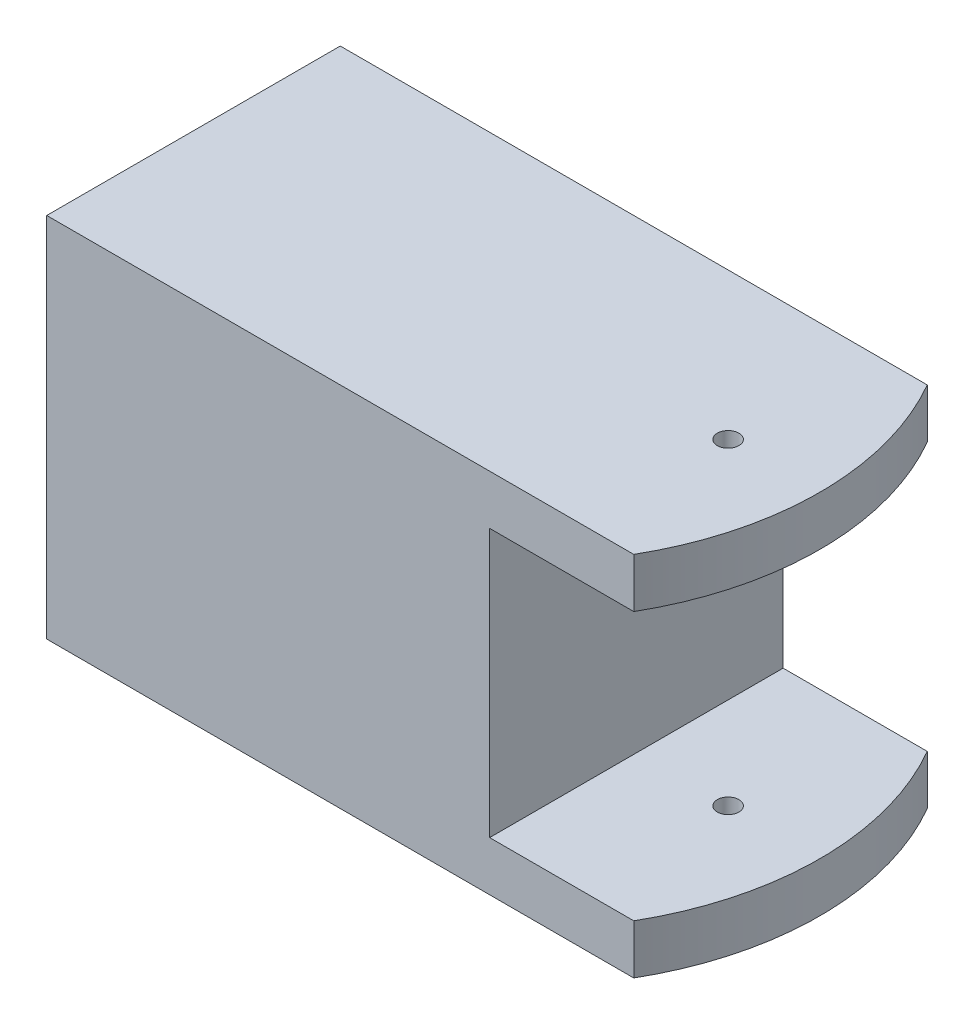
ISO-10303-21;
HEADER;
FILE_DESCRIPTION(('STEP AP214'),'2;1');
FILE_NAME('part.step','',(''),(''),'','','');
FILE_SCHEMA(('AUTOMOTIVE_DESIGN { 1 0 10303 214 1 1 1 1 }'));
ENDSEC;
DATA;
#1=APPLICATION_CONTEXT('core data for automotive mechanical design processes');
#2=APPLICATION_PROTOCOL_DEFINITION('international standard','automotive_design',2000,#1);
#3=PRODUCT_CONTEXT('',#1,'mechanical');
#4=PRODUCT('Part','Part','',(#3));
#5=PRODUCT_RELATED_PRODUCT_CATEGORY('part','',(#4));
#6=PRODUCT_DEFINITION_FORMATION('','',#4);
#7=PRODUCT_DEFINITION_CONTEXT('part definition',#1,'design');
#8=PRODUCT_DEFINITION('design','',#6,#7);
#9=PRODUCT_DEFINITION_SHAPE('','',#8);
#10=(LENGTH_UNIT() NAMED_UNIT(*) SI_UNIT(.MILLI.,.METRE.));
#11=(NAMED_UNIT(*) PLANE_ANGLE_UNIT() SI_UNIT($,.RADIAN.));
#12=(NAMED_UNIT(*) SI_UNIT($,.STERADIAN.) SOLID_ANGLE_UNIT());
#13=UNCERTAINTY_MEASURE_WITH_UNIT(LENGTH_MEASURE(1.E-05),#10,'distance_accuracy_value','');
#14=(GEOMETRIC_REPRESENTATION_CONTEXT(3) GLOBAL_UNCERTAINTY_ASSIGNED_CONTEXT((#13)) GLOBAL_UNIT_ASSIGNED_CONTEXT((#10,
#11,#12)) REPRESENTATION_CONTEXT('',''));
#15=CARTESIAN_POINT('',(0.,0.,0.));
#16=DIRECTION('',(0.,0.,1.));
#17=DIRECTION('',(1.,0.,0.));
#18=AXIS2_PLACEMENT_3D('',#15,#16,#17);
#19=CARTESIAN_POINT('',(-34.6410161513776,-25.,0.));
#20=DIRECTION('',(0.,1.,0.));
#21=DIRECTION('',(0.,0.,1.));
#22=AXIS2_PLACEMENT_3D('',#19,#20,#21);
#23=CYLINDRICAL_SURFACE('',#22,40.);
#24=CARTESIAN_POINT('',(-34.6410161513776,18.25,0.));
#25=DIRECTION('',(0.,1.,0.));
#26=DIRECTION('',(0.,0.,1.));
#27=AXIS2_PLACEMENT_3D('',#24,#25,#26);
#28=CIRCLE('',#27,40.);
#29=CARTESIAN_POINT('',(0.,18.25,-20.));
#30=VERTEX_POINT('',#29);
#31=CARTESIAN_POINT('',(0.,18.25,20.));
#32=VERTEX_POINT('',#31);
#33=EDGE_CURVE('E148',#30,#32,#28,.F.);
#34=ORIENTED_EDGE('',*,*,#33,.F.);
#35=DIRECTION('',(0.,1.,0.));
#36=VECTOR('',#35,1.);
#37=CARTESIAN_POINT('',(0.,-25.,-20.));
#38=LINE('',#37,#36);
#39=CARTESIAN_POINT('',(0.,25.,-20.));
#40=VERTEX_POINT('',#39);
#41=EDGE_CURVE('E181',#30,#40,#38,.T.);
#42=ORIENTED_EDGE('',*,*,#41,.T.);
#43=CARTESIAN_POINT('',(-34.6410161513776,25.,0.));
#44=DIRECTION('',(0.,1.,0.));
#45=DIRECTION('',(0.,0.,-1.));
#46=AXIS2_PLACEMENT_3D('',#43,#44,#45);
#47=CIRCLE('',#46,40.);
#48=CARTESIAN_POINT('',(0.,25.,20.));
#49=VERTEX_POINT('',#48);
#50=EDGE_CURVE('E151',#49,#40,#47,.T.);
#51=ORIENTED_EDGE('',*,*,#50,.F.);
#52=DIRECTION('',(0.,1.,0.));
#53=VECTOR('',#52,1.);
#54=CARTESIAN_POINT('',(0.,-25.,20.));
#55=LINE('',#54,#53);
#56=EDGE_CURVE('E184',#32,#49,#55,.T.);
#57=ORIENTED_EDGE('',*,*,#56,.F.);
#58=EDGE_LOOP('',(#34,#42,#51,#57));
#59=FACE_BOUND('',#58,.T.);
#60=ADVANCED_FACE('F45',(#59),#23,.T.);
#61=CARTESIAN_POINT('',(-34.6410161513776,-18.25,0.));
#62=DIRECTION('',(0.,-1.,0.));
#63=DIRECTION('',(0.,0.,-1.));
#64=AXIS2_PLACEMENT_3D('',#61,#62,#63);
#65=CIRCLE('',#64,40.);
#66=CARTESIAN_POINT('',(0.,-18.25,20.));
#67=VERTEX_POINT('',#66);
#68=CARTESIAN_POINT('',(0.,-18.25,-20.));
#69=VERTEX_POINT('',#68);
#70=EDGE_CURVE('E62',#67,#69,#65,.F.);
#71=ORIENTED_EDGE('',*,*,#70,.F.);
#72=CARTESIAN_POINT('',(0.,-25.,20.));
#73=VERTEX_POINT('',#72);
#74=EDGE_CURVE('E55',#73,#67,#55,.T.);
#75=ORIENTED_EDGE('',*,*,#74,.F.);
#76=CARTESIAN_POINT('',(-34.6410161513776,-25.,0.));
#77=DIRECTION('',(0.,1.,0.));
#78=DIRECTION('',(0.,0.,-1.));
#79=AXIS2_PLACEMENT_3D('',#76,#77,#78);
#80=CIRCLE('',#79,40.);
#81=CARTESIAN_POINT('',(0.,-25.,-20.));
#82=VERTEX_POINT('',#81);
#83=EDGE_CURVE('E167',#73,#82,#80,.T.);
#84=ORIENTED_EDGE('',*,*,#83,.T.);
#85=EDGE_CURVE('E191',#82,#69,#38,.T.);
#86=ORIENTED_EDGE('',*,*,#85,.T.);
#87=EDGE_LOOP('',(#71,#75,#84,#86));
#88=FACE_BOUND('',#87,.T.);
#89=ADVANCED_FACE('F47',(#88),#23,.T.);
#90=CARTESIAN_POINT('',(0.,-25.,20.));
#91=DIRECTION('',(0.,0.,1.));
#92=DIRECTION('',(1.,0.,0.));
#93=AXIS2_PLACEMENT_3D('',#90,#91,#92);
#94=PLANE('',#93);
#95=DIRECTION('',(-1.,0.,0.));
#96=VECTOR('',#95,1.);
#97=CARTESIAN_POINT('',(-19.6410161513775,18.25,20.));
#98=LINE('',#97,#96);
#99=CARTESIAN_POINT('',(-19.6410161513775,18.25,20.));
#100=VERTEX_POINT('',#99);
#101=EDGE_CURVE('E133',#32,#100,#98,.T.);
#102=ORIENTED_EDGE('',*,*,#101,.F.);
#103=ORIENTED_EDGE('',*,*,#56,.T.);
#104=DIRECTION('',(1.,0.,0.));
#105=VECTOR('',#104,1.);
#106=CARTESIAN_POINT('',(0.,25.,20.));
#107=LINE('',#106,#105);
#108=CARTESIAN_POINT('',(-80.,25.,20.));
#109=VERTEX_POINT('',#108);
#110=EDGE_CURVE('E163',#109,#49,#107,.T.);
#111=ORIENTED_EDGE('',*,*,#110,.F.);
#112=DIRECTION('',(0.,1.,0.));
#113=VECTOR('',#112,1.);
#114=CARTESIAN_POINT('',(-80.,-25.,20.));
#115=LINE('',#114,#113);
#116=CARTESIAN_POINT('',(-80.,-25.,20.));
#117=VERTEX_POINT('',#116);
#118=EDGE_CURVE('E185',#117,#109,#115,.T.);
#119=ORIENTED_EDGE('',*,*,#118,.F.);
#120=DIRECTION('',(1.,0.,0.));
#121=VECTOR('',#120,1.);
#122=CARTESIAN_POINT('',(0.,-25.,20.));
#123=LINE('',#122,#121);
#124=EDGE_CURVE('E178',#117,#73,#123,.T.);
#125=ORIENTED_EDGE('',*,*,#124,.T.);
#126=ORIENTED_EDGE('',*,*,#74,.T.);
#127=DIRECTION('',(1.,0.,0.));
#128=VECTOR('',#127,1.);
#129=CARTESIAN_POINT('',(-19.6410161513775,-18.25,20.));
#130=LINE('',#129,#128);
#131=CARTESIAN_POINT('',(-19.6410161513775,-18.25,20.));
#132=VERTEX_POINT('',#131);
#133=EDGE_CURVE('E113',#132,#67,#130,.T.);
#134=ORIENTED_EDGE('',*,*,#133,.F.);
#135=DIRECTION('',(0.,-1.,0.));
#136=VECTOR('',#135,1.);
#137=CARTESIAN_POINT('',(-19.6410161513775,18.25,20.));
#138=LINE('',#137,#136);
#139=EDGE_CURVE('E123',#100,#132,#138,.T.);
#140=ORIENTED_EDGE('',*,*,#139,.F.);
#141=EDGE_LOOP('',(#102,#103,#111,#119,#125,#126,#134,#140));
#142=FACE_BOUND('',#141,.T.);
#143=ADVANCED_FACE('F130',(#142),#94,.T.);
#144=CARTESIAN_POINT('',(-80.,-25.,20.));
#145=DIRECTION('',(-1.,0.,0.));
#146=DIRECTION('',(0.,0.,1.));
#147=AXIS2_PLACEMENT_3D('',#144,#145,#146);
#148=PLANE('',#147);
#149=ORIENTED_EDGE('',*,*,#118,.T.);
#150=DIRECTION('',(0.,0.,1.));
#151=VECTOR('',#150,1.);
#152=CARTESIAN_POINT('',(-80.,25.,20.));
#153=LINE('',#152,#151);
#154=CARTESIAN_POINT('',(-80.,25.,-20.));
#155=VERTEX_POINT('',#154);
#156=EDGE_CURVE('E159',#155,#109,#153,.T.);
#157=ORIENTED_EDGE('',*,*,#156,.F.);
#158=DIRECTION('',(0.,1.,0.));
#159=VECTOR('',#158,1.);
#160=CARTESIAN_POINT('',(-80.,-25.,-20.));
#161=LINE('',#160,#159);
#162=CARTESIAN_POINT('',(-80.,-25.,-20.));
#163=VERTEX_POINT('',#162);
#164=EDGE_CURVE('E188',#163,#155,#161,.T.);
#165=ORIENTED_EDGE('',*,*,#164,.F.);
#166=DIRECTION('',(0.,0.,1.));
#167=VECTOR('',#166,1.);
#168=CARTESIAN_POINT('',(-80.,-25.,20.));
#169=LINE('',#168,#167);
#170=EDGE_CURVE('E174',#163,#117,#169,.T.);
#171=ORIENTED_EDGE('',*,*,#170,.T.);
#172=EDGE_LOOP('',(#149,#157,#165,#171));
#173=FACE_BOUND('',#172,.T.);
#174=ADVANCED_FACE('F221',(#173),#148,.T.);
#175=CARTESIAN_POINT('',(0.,-25.,-20.));
#176=DIRECTION('',(0.,0.,-1.));
#177=DIRECTION('',(-1.,0.,0.));
#178=AXIS2_PLACEMENT_3D('',#175,#176,#177);
#179=PLANE('',#178);
#180=DIRECTION('',(1.,0.,0.));
#181=VECTOR('',#180,1.);
#182=CARTESIAN_POINT('',(0.,18.25,-20.));
#183=LINE('',#182,#181);
#184=CARTESIAN_POINT('',(-19.6410161513775,18.25,-20.));
#185=VERTEX_POINT('',#184);
#186=EDGE_CURVE('E11',#185,#30,#183,.T.);
#187=ORIENTED_EDGE('',*,*,#186,.F.);
#188=DIRECTION('',(0.,-1.,0.));
#189=VECTOR('',#188,1.);
#190=CARTESIAN_POINT('',(-19.6410161513775,18.25,-20.));
#191=LINE('',#190,#189);
#192=CARTESIAN_POINT('',(-19.6410161513775,-18.25,-20.));
#193=VERTEX_POINT('',#192);
#194=EDGE_CURVE('E136',#185,#193,#191,.T.);
#195=ORIENTED_EDGE('',*,*,#194,.T.);
#196=DIRECTION('',(1.,0.,0.));
#197=VECTOR('',#196,1.);
#198=CARTESIAN_POINT('',(-19.6410161513775,-18.25,-20.));
#199=LINE('',#198,#197);
#200=EDGE_CURVE('E114',#193,#69,#199,.T.);
#201=ORIENTED_EDGE('',*,*,#200,.T.);
#202=ORIENTED_EDGE('',*,*,#85,.F.);
#203=DIRECTION('',(-1.,0.,0.));
#204=VECTOR('',#203,1.);
#205=CARTESIAN_POINT('',(0.,-25.,-20.));
#206=LINE('',#205,#204);
#207=EDGE_CURVE('E170',#82,#163,#206,.T.);
#208=ORIENTED_EDGE('',*,*,#207,.T.);
#209=ORIENTED_EDGE('',*,*,#164,.T.);
#210=DIRECTION('',(-1.,0.,0.));
#211=VECTOR('',#210,1.);
#212=CARTESIAN_POINT('',(0.,25.,-20.));
#213=LINE('',#212,#211);
#214=EDGE_CURVE('E155',#40,#155,#213,.T.);
#215=ORIENTED_EDGE('',*,*,#214,.F.);
#216=ORIENTED_EDGE('',*,*,#41,.F.);
#217=EDGE_LOOP('',(#187,#195,#201,#202,#208,#209,#215,#216));
#218=FACE_BOUND('',#217,.T.);
#219=ADVANCED_FACE('F203',(#218),#179,.T.);
#220=CARTESIAN_POINT('',(-34.6410161513776,-25.,0.));
#221=DIRECTION('',(0.,-1.,0.));
#222=DIRECTION('',(0.,0.,-1.));
#223=AXIS2_PLACEMENT_3D('',#220,#221,#222);
#224=PLANE('',#223);
#225=CARTESIAN_POINT('',(-7.14101615137755,-25.,0.));
#226=DIRECTION('',(0.,1.,0.));
#227=DIRECTION('',(0.,0.,1.));
#228=AXIS2_PLACEMENT_3D('',#225,#226,#227);
#229=CIRCLE('',#228,1.47496878989552);
#230=CARTESIAN_POINT('',(-7.14101615137755,-25.,1.47496878989552));
#231=VERTEX_POINT('',#230);
#232=EDGE_CURVE('E321',#231,#231,#229,.T.);
#233=ORIENTED_EDGE('',*,*,#232,.T.);
#234=EDGE_LOOP('',(#233));
#235=FACE_BOUND('',#234,.T.);
#236=ORIENTED_EDGE('',*,*,#83,.F.);
#237=ORIENTED_EDGE('',*,*,#124,.F.);
#238=ORIENTED_EDGE('',*,*,#170,.F.);
#239=ORIENTED_EDGE('',*,*,#207,.F.);
#240=EDGE_LOOP('',(#236,#237,#238,#239));
#241=FACE_BOUND('',#240,.T.);
#242=ADVANCED_FACE('F214',(#235,#241),#224,.T.);
#243=CARTESIAN_POINT('',(-34.6410161513776,25.,0.));
#244=DIRECTION('',(0.,-1.,0.));
#245=DIRECTION('',(0.,0.,-1.));
#246=AXIS2_PLACEMENT_3D('',#243,#244,#245);
#247=PLANE('',#246);
#248=CARTESIAN_POINT('',(-7.14101615137755,25.,0.));
#249=DIRECTION('',(0.,1.,0.));
#250=DIRECTION('',(0.,0.,1.));
#251=AXIS2_PLACEMENT_3D('',#248,#249,#250);
#252=CIRCLE('',#251,1.47496878989552);
#253=CARTESIAN_POINT('',(-7.14101615137755,25.,1.47496878989552));
#254=VERTEX_POINT('',#253);
#255=EDGE_CURVE('E315',#254,#254,#252,.T.);
#256=ORIENTED_EDGE('',*,*,#255,.F.);
#257=EDGE_LOOP('',(#256));
#258=FACE_BOUND('',#257,.T.);
#259=ORIENTED_EDGE('',*,*,#50,.T.);
#260=ORIENTED_EDGE('',*,*,#214,.T.);
#261=ORIENTED_EDGE('',*,*,#156,.T.);
#262=ORIENTED_EDGE('',*,*,#110,.T.);
#263=EDGE_LOOP('',(#259,#260,#261,#262));
#264=FACE_BOUND('',#263,.T.);
#265=ADVANCED_FACE('F206',(#258,#264),#247,.F.);
#266=CARTESIAN_POINT('',(-19.6410161513775,18.25,-20.));
#267=DIRECTION('',(-1.,0.,0.));
#268=DIRECTION('',(0.,0.,1.));
#269=AXIS2_PLACEMENT_3D('',#266,#267,#268);
#270=PLANE('',#269);
#271=DIRECTION('',(0.,0.,1.));
#272=VECTOR('',#271,1.);
#273=CARTESIAN_POINT('',(-19.6410161513775,-18.25,-20.));
#274=LINE('',#273,#272);
#275=EDGE_CURVE('E109',#193,#132,#274,.T.);
#276=ORIENTED_EDGE('',*,*,#275,.F.);
#277=ORIENTED_EDGE('',*,*,#194,.F.);
#278=DIRECTION('',(0.,0.,1.));
#279=VECTOR('',#278,1.);
#280=CARTESIAN_POINT('',(-19.6410161513775,18.25,-20.));
#281=LINE('',#280,#279);
#282=EDGE_CURVE('E119',#185,#100,#281,.T.);
#283=ORIENTED_EDGE('',*,*,#282,.T.);
#284=ORIENTED_EDGE('',*,*,#139,.T.);
#285=EDGE_LOOP('',(#276,#277,#283,#284));
#286=FACE_BOUND('',#285,.T.);
#287=ADVANCED_FACE('F124',(#286),#270,.F.);
#288=CARTESIAN_POINT('',(-19.6410161513775,18.25,-20.));
#289=DIRECTION('',(0.,1.,0.));
#290=DIRECTION('',(0.,0.,1.));
#291=AXIS2_PLACEMENT_3D('',#288,#289,#290);
#292=PLANE('',#291);
#293=CARTESIAN_POINT('',(-7.14101615137755,18.25,0.));
#294=DIRECTION('',(0.,1.,0.));
#295=DIRECTION('',(0.,0.,1.));
#296=AXIS2_PLACEMENT_3D('',#293,#294,#295);
#297=CIRCLE('',#296,1.47496878989552);
#298=CARTESIAN_POINT('',(-7.14101615137755,18.25,1.47496878989552));
#299=VERTEX_POINT('',#298);
#300=EDGE_CURVE('E128',#299,#299,#297,.T.);
#301=ORIENTED_EDGE('',*,*,#300,.T.);
#302=EDGE_LOOP('',(#301));
#303=FACE_BOUND('',#302,.T.);
#304=ORIENTED_EDGE('',*,*,#33,.T.);
#305=ORIENTED_EDGE('',*,*,#101,.T.);
#306=ORIENTED_EDGE('',*,*,#282,.F.);
#307=ORIENTED_EDGE('',*,*,#186,.T.);
#308=EDGE_LOOP('',(#304,#305,#306,#307));
#309=FACE_BOUND('',#308,.T.);
#310=ADVANCED_FACE('F210',(#303,#309),#292,.F.);
#311=CARTESIAN_POINT('',(-19.6410161513775,-18.25,-20.));
#312=DIRECTION('',(0.,-1.,0.));
#313=DIRECTION('',(0.,0.,-1.));
#314=AXIS2_PLACEMENT_3D('',#311,#312,#313);
#315=PLANE('',#314);
#316=CARTESIAN_POINT('',(-7.14101615137755,-18.25,0.));
#317=DIRECTION('',(0.,-1.,0.));
#318=DIRECTION('',(0.,0.,-1.));
#319=AXIS2_PLACEMENT_3D('',#316,#317,#318);
#320=CIRCLE('',#319,1.47496878989552);
#321=CARTESIAN_POINT('',(-7.14101615137755,-18.25,-1.47496878989552));
#322=VERTEX_POINT('',#321);
#323=EDGE_CURVE('E49',#322,#322,#320,.T.);
#324=ORIENTED_EDGE('',*,*,#323,.T.);
#325=EDGE_LOOP('',(#324));
#326=FACE_BOUND('',#325,.T.);
#327=ORIENTED_EDGE('',*,*,#70,.T.);
#328=ORIENTED_EDGE('',*,*,#200,.F.);
#329=ORIENTED_EDGE('',*,*,#275,.T.);
#330=ORIENTED_EDGE('',*,*,#133,.T.);
#331=EDGE_LOOP('',(#327,#328,#329,#330));
#332=FACE_BOUND('',#331,.T.);
#333=ADVANCED_FACE('F111',(#326,#332),#315,.F.);
#334=CARTESIAN_POINT('',(-7.14101615137755,-25.,0.));
#335=DIRECTION('',(0.,1.,0.));
#336=DIRECTION('',(0.,0.,1.));
#337=AXIS2_PLACEMENT_3D('',#334,#335,#336);
#338=CYLINDRICAL_SURFACE('',#337,1.47496878989552);
#339=ORIENTED_EDGE('',*,*,#232,.F.);
#340=EDGE_LOOP('',(#339));
#341=FACE_BOUND('',#340,.T.);
#342=ORIENTED_EDGE('',*,*,#323,.F.);
#343=EDGE_LOOP('',(#342));
#344=FACE_BOUND('',#343,.T.);
#345=ADVANCED_FACE('F290',(#341,#344),#338,.F.);
#346=ORIENTED_EDGE('',*,*,#255,.T.);
#347=EDGE_LOOP('',(#346));
#348=FACE_BOUND('',#347,.T.);
#349=ORIENTED_EDGE('',*,*,#300,.F.);
#350=EDGE_LOOP('',(#349));
#351=FACE_BOUND('',#350,.T.);
#352=ADVANCED_FACE('F300',(#348,#351),#338,.F.);
#353=CLOSED_SHELL('',(#60,#89,#143,#174,#219,#242,#265,#287,#310,#333,#345,#352));
#354=MANIFOLD_SOLID_BREP('B2',#353);
#355=ADVANCED_BREP_SHAPE_REPRESENTATION('',(#18,#354),#14);
#356=SHAPE_DEFINITION_REPRESENTATION(#9,#355);
ENDSEC;
END-ISO-10303-21;
